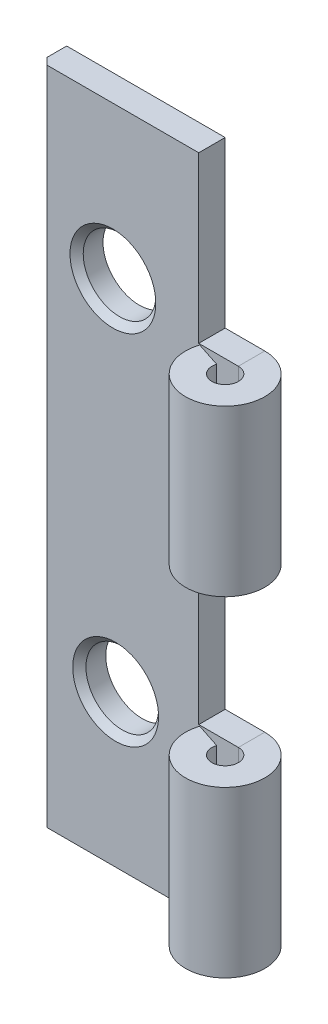
ISO-10303-21;
HEADER;
FILE_DESCRIPTION(('STEP AP214'),'2;1');
FILE_NAME('part.step','',(''),(''),'','','');
FILE_SCHEMA(('AUTOMOTIVE_DESIGN { 1 0 10303 214 1 1 1 1 }'));
ENDSEC;
DATA;
#1=APPLICATION_CONTEXT('core data for automotive mechanical design processes');
#2=APPLICATION_PROTOCOL_DEFINITION('international standard','automotive_design',2000,#1);
#3=PRODUCT_CONTEXT('',#1,'mechanical');
#4=PRODUCT('Part','Part','',(#3));
#5=PRODUCT_RELATED_PRODUCT_CATEGORY('part','',(#4));
#6=PRODUCT_DEFINITION_FORMATION('','',#4);
#7=PRODUCT_DEFINITION_CONTEXT('part definition',#1,'design');
#8=PRODUCT_DEFINITION('design','',#6,#7);
#9=PRODUCT_DEFINITION_SHAPE('','',#8);
#10=(LENGTH_UNIT() NAMED_UNIT(*) SI_UNIT(.MILLI.,.METRE.));
#11=(NAMED_UNIT(*) PLANE_ANGLE_UNIT() SI_UNIT($,.RADIAN.));
#12=(NAMED_UNIT(*) SI_UNIT($,.STERADIAN.) SOLID_ANGLE_UNIT());
#13=UNCERTAINTY_MEASURE_WITH_UNIT(LENGTH_MEASURE(1.E-05),#10,'distance_accuracy_value','');
#14=(GEOMETRIC_REPRESENTATION_CONTEXT(3) GLOBAL_UNCERTAINTY_ASSIGNED_CONTEXT((#13)) GLOBAL_UNIT_ASSIGNED_CONTEXT((#10,
#11,#12)) REPRESENTATION_CONTEXT('',''));
#15=CARTESIAN_POINT('',(0.,0.,0.));
#16=DIRECTION('',(0.,0.,1.));
#17=DIRECTION('',(1.,0.,0.));
#18=AXIS2_PLACEMENT_3D('',#15,#16,#17);
#19=CARTESIAN_POINT('',(0.,0.,0.));
#20=DIRECTION('',(0.,0.,-1.));
#21=DIRECTION('',(-1.,0.,0.));
#22=AXIS2_PLACEMENT_3D('',#19,#20,#21);
#23=PLANE('',#22);
#24=CARTESIAN_POINT('',(1.342615779689,-13.5,0.));
#25=DIRECTION('',(0.,0.,-1.));
#26=DIRECTION('',(-1.,0.,0.));
#27=AXIS2_PLACEMENT_3D('',#24,#25,#26);
#28=CIRCLE('',#27,3.25);
#29=CARTESIAN_POINT('',(-1.907384220311,-13.5,0.));
#30=VERTEX_POINT('',#29);
#31=EDGE_CURVE('E181',#30,#30,#28,.T.);
#32=ORIENTED_EDGE('',*,*,#31,.T.);
#33=EDGE_LOOP('',(#32));
#34=FACE_BOUND('',#33,.T.);
#35=CARTESIAN_POINT('',(1.13428782480229,13.5,0.));
#36=DIRECTION('',(0.,0.,-1.));
#37=DIRECTION('',(-1.,0.,0.));
#38=AXIS2_PLACEMENT_3D('',#35,#36,#37);
#39=CIRCLE('',#38,3.25);
#40=CARTESIAN_POINT('',(-2.11571217519771,13.5,0.));
#41=VERTEX_POINT('',#40);
#42=EDGE_CURVE('E178',#41,#41,#39,.T.);
#43=ORIENTED_EDGE('',*,*,#42,.T.);
#44=EDGE_LOOP('',(#43));
#45=FACE_BOUND('',#44,.T.);
#46=DIRECTION('',(-1.,0.,0.));
#47=VECTOR('',#46,1.);
#48=CARTESIAN_POINT('',(-4.36571217519771,25.,0.));
#49=LINE('',#48,#47);
#50=CARTESIAN_POINT('',(7.63428782480229,25.,0.));
#51=VERTEX_POINT('',#50);
#52=CARTESIAN_POINT('',(-3.86571217519771,25.,0.));
#53=VERTEX_POINT('',#52);
#54=EDGE_CURVE('E141',#51,#53,#49,.T.);
#55=ORIENTED_EDGE('',*,*,#54,.T.);
#56=DIRECTION('',(0.,-1.,0.));
#57=VECTOR('',#56,1.);
#58=CARTESIAN_POINT('',(-3.86571217519771,-25.,0.));
#59=LINE('',#58,#57);
#60=CARTESIAN_POINT('',(-3.86571217519771,-25.,0.));
#61=VERTEX_POINT('',#60);
#62=EDGE_CURVE('E175',#53,#61,#59,.T.);
#63=ORIENTED_EDGE('',*,*,#62,.T.);
#64=DIRECTION('',(1.,0.,0.));
#65=VECTOR('',#64,1.);
#66=CARTESIAN_POINT('',(-4.36571217519771,-25.,0.));
#67=LINE('',#66,#65);
#68=CARTESIAN_POINT('',(10.6342878248023,-25.,0.));
#69=VERTEX_POINT('',#68);
#70=EDGE_CURVE('E153',#61,#69,#67,.T.);
#71=ORIENTED_EDGE('',*,*,#70,.T.);
#72=DIRECTION('',(0.,1.,0.));
#73=VECTOR('',#72,1.);
#74=CARTESIAN_POINT('',(10.6342878248023,-25.,0.));
#75=LINE('',#74,#73);
#76=CARTESIAN_POINT('',(10.6342878248023,-12.5,0.));
#77=VERTEX_POINT('',#76);
#78=EDGE_CURVE('E160',#69,#77,#75,.T.);
#79=ORIENTED_EDGE('',*,*,#78,.T.);
#80=DIRECTION('',(1.,0.,0.));
#81=VECTOR('',#80,1.);
#82=CARTESIAN_POINT('',(10.6342878248023,-12.5,0.));
#83=LINE('',#82,#81);
#84=CARTESIAN_POINT('',(7.63428782480229,-12.5,0.));
#85=VERTEX_POINT('',#84);
#86=EDGE_CURVE('E262',#85,#77,#83,.T.);
#87=ORIENTED_EDGE('',*,*,#86,.F.);
#88=DIRECTION('',(0.,-1.,0.));
#89=VECTOR('',#88,1.);
#90=CARTESIAN_POINT('',(7.63428782480229,0.,0.));
#91=LINE('',#90,#89);
#92=CARTESIAN_POINT('',(7.63428782480229,0.,0.));
#93=VERTEX_POINT('',#92);
#94=EDGE_CURVE('E247',#93,#85,#91,.T.);
#95=ORIENTED_EDGE('',*,*,#94,.F.);
#96=DIRECTION('',(-1.,0.,0.));
#97=VECTOR('',#96,1.);
#98=CARTESIAN_POINT('',(10.6342878248023,0.,0.));
#99=LINE('',#98,#97);
#100=CARTESIAN_POINT('',(10.6342878248023,0.,0.));
#101=VERTEX_POINT('',#100);
#102=EDGE_CURVE('E244',#101,#93,#99,.T.);
#103=ORIENTED_EDGE('',*,*,#102,.F.);
#104=DIRECTION('',(0.,1.,0.));
#105=VECTOR('',#104,1.);
#106=CARTESIAN_POINT('',(10.6342878248023,12.5,0.));
#107=LINE('',#106,#105);
#108=CARTESIAN_POINT('',(10.6342878248023,12.5,0.));
#109=VERTEX_POINT('',#108);
#110=EDGE_CURVE('E314',#109,#101,#107,.F.);
#111=ORIENTED_EDGE('',*,*,#110,.F.);
#112=DIRECTION('',(1.,0.,0.));
#113=VECTOR('',#112,1.);
#114=CARTESIAN_POINT('',(10.6342878248023,12.5,0.));
#115=LINE('',#114,#113);
#116=CARTESIAN_POINT('',(7.63428782480229,12.5,0.));
#117=VERTEX_POINT('',#116);
#118=EDGE_CURVE('E134',#117,#109,#115,.T.);
#119=ORIENTED_EDGE('',*,*,#118,.F.);
#120=DIRECTION('',(0.,-1.,0.));
#121=VECTOR('',#120,1.);
#122=CARTESIAN_POINT('',(7.63428782480229,25.,0.));
#123=LINE('',#122,#121);
#124=EDGE_CURVE('E252',#51,#117,#123,.T.);
#125=ORIENTED_EDGE('',*,*,#124,.F.);
#126=EDGE_LOOP('',(#55,#63,#71,#79,#87,#95,#103,#111,#119,#125));
#127=FACE_BOUND('',#126,.T.);
#128=ADVANCED_FACE('F17',(#34,#45,#127),#23,.F.);
#129=CARTESIAN_POINT('',(-4.36571217519771,-25.,-2.));
#130=DIRECTION('',(0.,-1.,0.));
#131=DIRECTION('',(0.,0.,-1.));
#132=AXIS2_PLACEMENT_3D('',#129,#130,#131);
#133=PLANE('',#132);
#134=ORIENTED_EDGE('',*,*,#70,.F.);
#135=DIRECTION('',(-0.707106781186548,0.,-0.707106781186548));
#136=VECTOR('',#135,1.);
#137=CARTESIAN_POINT('',(-5.11571217519771,-25.,-1.25));
#138=LINE('',#137,#136);
#139=CARTESIAN_POINT('',(-4.36571217519771,-25.,-0.5));
#140=VERTEX_POINT('',#139);
#141=EDGE_CURVE('E39',#61,#140,#138,.T.);
#142=ORIENTED_EDGE('',*,*,#141,.T.);
#143=DIRECTION('',(0.,0.,1.));
#144=VECTOR('',#143,1.);
#145=CARTESIAN_POINT('',(-4.36571217519771,-25.,-2.));
#146=LINE('',#145,#144);
#147=CARTESIAN_POINT('',(-4.36571217519771,-25.,-2.));
#148=VERTEX_POINT('',#147);
#149=EDGE_CURVE('E170',#148,#140,#146,.T.);
#150=ORIENTED_EDGE('',*,*,#149,.F.);
#151=DIRECTION('',(1.,0.,0.));
#152=VECTOR('',#151,1.);
#153=CARTESIAN_POINT('',(-4.36571217519771,-25.,-2.));
#154=LINE('',#153,#152);
#155=CARTESIAN_POINT('',(10.6342878248023,-25.,-2.));
#156=VERTEX_POINT('',#155);
#157=EDGE_CURVE('E150',#148,#156,#154,.T.);
#158=ORIENTED_EDGE('',*,*,#157,.T.);
#159=DIRECTION('',(0.,0.,1.));
#160=VECTOR('',#159,1.);
#161=CARTESIAN_POINT('',(10.6342878248023,-25.,-2.));
#162=LINE('',#161,#160);
#163=EDGE_CURVE('E166',#156,#69,#162,.T.);
#164=ORIENTED_EDGE('',*,*,#163,.T.);
#165=EDGE_LOOP('',(#134,#142,#150,#158,#164));
#166=FACE_BOUND('',#165,.T.);
#167=ADVANCED_FACE('F207',(#166),#133,.T.);
#168=CARTESIAN_POINT('',(-4.36571217519771,-25.,-2.));
#169=DIRECTION('',(-1.,0.,0.));
#170=DIRECTION('',(0.,0.,1.));
#171=AXIS2_PLACEMENT_3D('',#168,#169,#170);
#172=PLANE('',#171);
#173=ORIENTED_EDGE('',*,*,#149,.T.);
#174=DIRECTION('',(0.,1.,0.));
#175=VECTOR('',#174,1.);
#176=CARTESIAN_POINT('',(-4.36571217519771,25.,-0.5));
#177=LINE('',#176,#175);
#178=CARTESIAN_POINT('',(-4.36571217519771,25.,-0.5));
#179=VERTEX_POINT('',#178);
#180=EDGE_CURVE('E25',#140,#179,#177,.T.);
#181=ORIENTED_EDGE('',*,*,#180,.T.);
#182=DIRECTION('',(0.,0.,1.));
#183=VECTOR('',#182,1.);
#184=CARTESIAN_POINT('',(-4.36571217519771,25.,-2.));
#185=LINE('',#184,#183);
#186=CARTESIAN_POINT('',(-4.36571217519771,25.,-2.));
#187=VERTEX_POINT('',#186);
#188=EDGE_CURVE('E159',#187,#179,#185,.T.);
#189=ORIENTED_EDGE('',*,*,#188,.F.);
#190=DIRECTION('',(0.,-1.,0.));
#191=VECTOR('',#190,1.);
#192=CARTESIAN_POINT('',(-4.36571217519771,-25.,-2.));
#193=LINE('',#192,#191);
#194=EDGE_CURVE('E147',#187,#148,#193,.T.);
#195=ORIENTED_EDGE('',*,*,#194,.T.);
#196=EDGE_LOOP('',(#173,#181,#189,#195));
#197=FACE_BOUND('',#196,.T.);
#198=ADVANCED_FACE('F214',(#197),#172,.T.);
#199=CARTESIAN_POINT('',(-4.36571217519771,25.,-2.));
#200=DIRECTION('',(0.,1.,0.));
#201=DIRECTION('',(0.,0.,1.));
#202=AXIS2_PLACEMENT_3D('',#199,#200,#201);
#203=PLANE('',#202);
#204=ORIENTED_EDGE('',*,*,#188,.T.);
#205=DIRECTION('',(0.707106781186548,0.,0.707106781186548));
#206=VECTOR('',#205,1.);
#207=CARTESIAN_POINT('',(-5.11571217519771,25.,-1.25));
#208=LINE('',#207,#206);
#209=EDGE_CURVE('E11',#179,#53,#208,.T.);
#210=ORIENTED_EDGE('',*,*,#209,.T.);
#211=ORIENTED_EDGE('',*,*,#54,.F.);
#212=DIRECTION('',(0.,0.,1.));
#213=VECTOR('',#212,1.);
#214=CARTESIAN_POINT('',(7.63428782480229,25.,-2.));
#215=LINE('',#214,#213);
#216=CARTESIAN_POINT('',(7.63428782480229,25.,-2.));
#217=VERTEX_POINT('',#216);
#218=EDGE_CURVE('E126',#217,#51,#215,.T.);
#219=ORIENTED_EDGE('',*,*,#218,.F.);
#220=DIRECTION('',(-1.,0.,0.));
#221=VECTOR('',#220,1.);
#222=CARTESIAN_POINT('',(-4.36571217519771,25.,-2.));
#223=LINE('',#222,#221);
#224=EDGE_CURVE('E139',#217,#187,#223,.T.);
#225=ORIENTED_EDGE('',*,*,#224,.T.);
#226=EDGE_LOOP('',(#204,#210,#211,#219,#225));
#227=FACE_BOUND('',#226,.T.);
#228=ADVANCED_FACE('F138',(#227),#203,.T.);
#229=CARTESIAN_POINT('',(0.,0.,-2.));
#230=DIRECTION('',(0.,0.,-1.));
#231=DIRECTION('',(-1.,0.,0.));
#232=AXIS2_PLACEMENT_3D('',#229,#230,#231);
#233=PLANE('',#232);
#234=CARTESIAN_POINT('',(1.13428782480229,13.5,-2.));
#235=DIRECTION('',(0.,0.,-1.));
#236=DIRECTION('',(-1.,0.,0.));
#237=AXIS2_PLACEMENT_3D('',#234,#235,#236);
#238=CIRCLE('',#237,2.75);
#239=CARTESIAN_POINT('',(-1.61571217519771,13.5,-2.));
#240=VERTEX_POINT('',#239);
#241=EDGE_CURVE('E239',#240,#240,#238,.T.);
#242=ORIENTED_EDGE('',*,*,#241,.F.);
#243=EDGE_LOOP('',(#242));
#244=FACE_BOUND('',#243,.T.);
#245=CARTESIAN_POINT('',(1.342615779689,-13.5,-2.));
#246=DIRECTION('',(0.,0.,-1.));
#247=DIRECTION('',(-1.,0.,0.));
#248=AXIS2_PLACEMENT_3D('',#245,#246,#247);
#249=CIRCLE('',#248,2.75);
#250=CARTESIAN_POINT('',(-1.407384220311,-13.5,-2.));
#251=VERTEX_POINT('',#250);
#252=EDGE_CURVE('E242',#251,#251,#249,.T.);
#253=ORIENTED_EDGE('',*,*,#252,.F.);
#254=EDGE_LOOP('',(#253));
#255=FACE_BOUND('',#254,.T.);
#256=DIRECTION('',(1.,0.,0.));
#257=VECTOR('',#256,1.);
#258=CARTESIAN_POINT('',(10.6342878248023,12.5,-2.));
#259=LINE('',#258,#257);
#260=CARTESIAN_POINT('',(7.63428782480229,12.5,-2.));
#261=VERTEX_POINT('',#260);
#262=CARTESIAN_POINT('',(10.6342878248023,12.5,-2.));
#263=VERTEX_POINT('',#262);
#264=EDGE_CURVE('E133',#261,#263,#259,.T.);
#265=ORIENTED_EDGE('',*,*,#264,.T.);
#266=DIRECTION('',(0.,1.,0.));
#267=VECTOR('',#266,1.);
#268=CARTESIAN_POINT('',(10.6342878248023,12.5,-2.));
#269=LINE('',#268,#267);
#270=CARTESIAN_POINT('',(10.6342878248023,0.,-2.));
#271=VERTEX_POINT('',#270);
#272=EDGE_CURVE('E298',#263,#271,#269,.F.);
#273=ORIENTED_EDGE('',*,*,#272,.T.);
#274=DIRECTION('',(-1.,0.,0.));
#275=VECTOR('',#274,1.);
#276=CARTESIAN_POINT('',(10.6342878248023,0.,-2.));
#277=LINE('',#276,#275);
#278=CARTESIAN_POINT('',(7.63428782480229,0.,-2.));
#279=VERTEX_POINT('',#278);
#280=EDGE_CURVE('E258',#271,#279,#277,.T.);
#281=ORIENTED_EDGE('',*,*,#280,.T.);
#282=DIRECTION('',(0.,-1.,0.));
#283=VECTOR('',#282,1.);
#284=CARTESIAN_POINT('',(7.63428782480229,0.,-2.));
#285=LINE('',#284,#283);
#286=CARTESIAN_POINT('',(7.63428782480229,-12.5,-2.));
#287=VERTEX_POINT('',#286);
#288=EDGE_CURVE('E261',#279,#287,#285,.T.);
#289=ORIENTED_EDGE('',*,*,#288,.T.);
#290=DIRECTION('',(1.,0.,0.));
#291=VECTOR('',#290,1.);
#292=CARTESIAN_POINT('',(10.6342878248023,-12.5,-2.));
#293=LINE('',#292,#291);
#294=CARTESIAN_POINT('',(10.6342878248023,-12.5,-2.));
#295=VERTEX_POINT('',#294);
#296=EDGE_CURVE('E265',#287,#295,#293,.T.);
#297=ORIENTED_EDGE('',*,*,#296,.T.);
#298=DIRECTION('',(0.,1.,0.));
#299=VECTOR('',#298,1.);
#300=CARTESIAN_POINT('',(10.6342878248023,-25.,-2.));
#301=LINE('',#300,#299);
#302=EDGE_CURVE('E148',#156,#295,#301,.T.);
#303=ORIENTED_EDGE('',*,*,#302,.F.);
#304=ORIENTED_EDGE('',*,*,#157,.F.);
#305=ORIENTED_EDGE('',*,*,#194,.F.);
#306=ORIENTED_EDGE('',*,*,#224,.F.);
#307=DIRECTION('',(0.,-1.,0.));
#308=VECTOR('',#307,1.);
#309=CARTESIAN_POINT('',(7.63428782480229,25.,-2.));
#310=LINE('',#309,#308);
#311=EDGE_CURVE('E122',#217,#261,#310,.T.);
#312=ORIENTED_EDGE('',*,*,#311,.T.);
#313=EDGE_LOOP('',(#265,#273,#281,#289,#297,#303,#304,#305,#306,#312));
#314=FACE_BOUND('',#313,.T.);
#315=ADVANCED_FACE('F144',(#244,#255,#314),#233,.T.);
#316=CARTESIAN_POINT('',(9.68323130850714,6.25,0.690983005625043));
#317=DIRECTION('',(-0.309016994374957,0.,0.95105651629515));
#318=DIRECTION('',(0.,1.,0.));
#319=AXIS2_PLACEMENT_3D('',#316,#317,#318);
#320=PLANE('',#319);
#321=DIRECTION('',(-0.95105651629515,0.,-0.309016994374957));
#322=VECTOR('',#321,1.);
#323=CARTESIAN_POINT('',(9.68323130850714,12.5,0.690983005625043));
#324=LINE('',#323,#322);
#325=CARTESIAN_POINT('',(9.68323130850714,12.5,0.690983005625043));
#326=VERTEX_POINT('',#325);
#327=CARTESIAN_POINT('',(7.78111827591684,12.5,0.0729490168751275));
#328=VERTEX_POINT('',#327);
#329=EDGE_CURVE('E163',#326,#328,#324,.T.);
#330=ORIENTED_EDGE('',*,*,#329,.F.);
#331=DIRECTION('',(0.,1.,0.));
#332=VECTOR('',#331,1.);
#333=CARTESIAN_POINT('',(9.68323130850714,12.5,0.690983005625043));
#334=LINE('',#333,#332);
#335=CARTESIAN_POINT('',(9.68323130850714,0.,0.690983005625043));
#336=VERTEX_POINT('',#335);
#337=EDGE_CURVE('E296',#336,#326,#334,.T.);
#338=ORIENTED_EDGE('',*,*,#337,.F.);
#339=DIRECTION('',(-0.95105651629515,0.,-0.309016994374957));
#340=VECTOR('',#339,1.);
#341=CARTESIAN_POINT('',(9.68323130850714,0.,0.690983005625043));
#342=LINE('',#341,#340);
#343=CARTESIAN_POINT('',(7.78111827591684,0.,0.0729490168751275));
#344=VERTEX_POINT('',#343);
#345=EDGE_CURVE('E325',#336,#344,#342,.T.);
#346=ORIENTED_EDGE('',*,*,#345,.T.);
#347=DIRECTION('',(0.,1.,0.));
#348=VECTOR('',#347,1.);
#349=CARTESIAN_POINT('',(7.78111827591684,12.5,0.0729490168751275));
#350=LINE('',#349,#348);
#351=EDGE_CURVE('E306',#344,#328,#350,.T.);
#352=ORIENTED_EDGE('',*,*,#351,.T.);
#353=EDGE_LOOP('',(#330,#338,#346,#352));
#354=FACE_BOUND('',#353,.T.);
#355=ADVANCED_FACE('F227',(#354),#320,.F.);
#356=CARTESIAN_POINT('',(10.6342878248023,0.,1.));
#357=DIRECTION('',(0.,-1.,0.));
#358=DIRECTION('',(0.,0.,-1.));
#359=AXIS2_PLACEMENT_3D('',#356,#357,#358);
#360=PLANE('',#359);
#361=ORIENTED_EDGE('',*,*,#345,.F.);
#362=CARTESIAN_POINT('',(10.6342878248023,0.,1.));
#363=DIRECTION('',(0.,1.,0.));
#364=DIRECTION('',(0.,0.,1.));
#365=AXIS2_PLACEMENT_3D('',#362,#363,#364);
#366=CIRCLE('',#365,1.);
#367=EDGE_CURVE('E309',#101,#336,#366,.F.);
#368=ORIENTED_EDGE('',*,*,#367,.F.);
#369=DIRECTION('',(0.,0.,-1.));
#370=VECTOR('',#369,1.);
#371=CARTESIAN_POINT('',(10.6342878248023,0.,0.));
#372=LINE('',#371,#370);
#373=EDGE_CURVE('E322',#101,#271,#372,.T.);
#374=ORIENTED_EDGE('',*,*,#373,.T.);
#375=CARTESIAN_POINT('',(10.6342878248023,0.,1.));
#376=DIRECTION('',(0.,1.,0.));
#377=DIRECTION('',(0.,0.,1.));
#378=AXIS2_PLACEMENT_3D('',#375,#376,#377);
#379=CIRCLE('',#378,3.);
#380=EDGE_CURVE('E301',#271,#344,#379,.F.);
#381=ORIENTED_EDGE('',*,*,#380,.T.);
#382=EDGE_LOOP('',(#361,#368,#374,#381));
#383=FACE_BOUND('',#382,.T.);
#384=ADVANCED_FACE('F233',(#383),#360,.T.);
#385=CARTESIAN_POINT('',(10.6342878248023,12.5,1.));
#386=DIRECTION('',(0.,-1.,0.));
#387=DIRECTION('',(0.,0.,-1.));
#388=AXIS2_PLACEMENT_3D('',#385,#386,#387);
#389=PLANE('',#388);
#390=CARTESIAN_POINT('',(10.6342878248023,12.5,1.));
#391=DIRECTION('',(0.,1.,0.));
#392=DIRECTION('',(0.,0.,1.));
#393=AXIS2_PLACEMENT_3D('',#390,#391,#392);
#394=CIRCLE('',#393,1.);
#395=EDGE_CURVE('E317',#326,#109,#394,.T.);
#396=ORIENTED_EDGE('',*,*,#395,.F.);
#397=ORIENTED_EDGE('',*,*,#329,.T.);
#398=CARTESIAN_POINT('',(10.6342878248023,12.5,1.));
#399=DIRECTION('',(0.,1.,0.));
#400=DIRECTION('',(0.,0.,1.));
#401=AXIS2_PLACEMENT_3D('',#398,#399,#400);
#402=CIRCLE('',#401,3.);
#403=EDGE_CURVE('E302',#328,#263,#402,.T.);
#404=ORIENTED_EDGE('',*,*,#403,.T.);
#405=DIRECTION('',(0.,0.,-1.));
#406=VECTOR('',#405,1.);
#407=CARTESIAN_POINT('',(10.6342878248023,12.5,0.));
#408=LINE('',#407,#406);
#409=EDGE_CURVE('E305',#109,#263,#408,.T.);
#410=ORIENTED_EDGE('',*,*,#409,.F.);
#411=EDGE_LOOP('',(#396,#397,#404,#410));
#412=FACE_BOUND('',#411,.T.);
#413=ADVANCED_FACE('F335',(#412),#389,.F.);
#414=CARTESIAN_POINT('',(10.6342878248023,12.5,1.));
#415=DIRECTION('',(0.,1.,0.));
#416=DIRECTION('',(-0.95105651629515,0.,-0.309016994374957));
#417=AXIS2_PLACEMENT_3D('',#414,#415,#416);
#418=CYLINDRICAL_SURFACE('',#417,3.);
#419=ORIENTED_EDGE('',*,*,#272,.F.);
#420=ORIENTED_EDGE('',*,*,#403,.F.);
#421=ORIENTED_EDGE('',*,*,#351,.F.);
#422=ORIENTED_EDGE('',*,*,#380,.F.);
#423=EDGE_LOOP('',(#419,#420,#421,#422));
#424=FACE_BOUND('',#423,.T.);
#425=ADVANCED_FACE('F339',(#424),#418,.T.);
#426=CARTESIAN_POINT('',(10.6342878248023,12.5,1.));
#427=DIRECTION('',(0.,1.,0.));
#428=DIRECTION('',(-0.95105651629515,0.,-0.309016994374957));
#429=AXIS2_PLACEMENT_3D('',#426,#427,#428);
#430=CYLINDRICAL_SURFACE('',#429,1.);
#431=ORIENTED_EDGE('',*,*,#110,.T.);
#432=ORIENTED_EDGE('',*,*,#367,.T.);
#433=ORIENTED_EDGE('',*,*,#337,.T.);
#434=ORIENTED_EDGE('',*,*,#395,.T.);
#435=EDGE_LOOP('',(#431,#432,#433,#434));
#436=FACE_BOUND('',#435,.T.);
#437=ADVANCED_FACE('F351',(#436),#430,.F.);
#438=CARTESIAN_POINT('',(9.68323130850714,-18.75,0.690983005625041));
#439=DIRECTION('',(-0.309016994374958,0.,0.95105651629515));
#440=DIRECTION('',(0.,1.,0.));
#441=AXIS2_PLACEMENT_3D('',#438,#439,#440);
#442=PLANE('',#441);
#443=DIRECTION('',(-0.95105651629515,0.,-0.309016994374958));
#444=VECTOR('',#443,1.);
#445=CARTESIAN_POINT('',(9.68323130850714,-12.5,0.690983005625041));
#446=LINE('',#445,#444);
#447=CARTESIAN_POINT('',(9.68323130850714,-12.5,0.690983005625041));
#448=VERTEX_POINT('',#447);
#449=CARTESIAN_POINT('',(7.78111827591684,-12.5,0.0729490168751239));
#450=VERTEX_POINT('',#449);
#451=EDGE_CURVE('E294',#448,#450,#446,.T.);
#452=ORIENTED_EDGE('',*,*,#451,.F.);
#453=DIRECTION('',(0.,1.,0.));
#454=VECTOR('',#453,1.);
#455=CARTESIAN_POINT('',(9.68323130850714,-12.5,0.690983005625041));
#456=LINE('',#455,#454);
#457=CARTESIAN_POINT('',(9.68323130850714,-25.,0.690983005625041));
#458=VERTEX_POINT('',#457);
#459=EDGE_CURVE('E256',#458,#448,#456,.T.);
#460=ORIENTED_EDGE('',*,*,#459,.F.);
#461=DIRECTION('',(-0.95105651629515,0.,-0.309016994374958));
#462=VECTOR('',#461,1.);
#463=CARTESIAN_POINT('',(9.68323130850714,-25.,0.690983005625041));
#464=LINE('',#463,#462);
#465=CARTESIAN_POINT('',(7.78111827591684,-25.,0.0729490168751239));
#466=VERTEX_POINT('',#465);
#467=EDGE_CURVE('E292',#458,#466,#464,.T.);
#468=ORIENTED_EDGE('',*,*,#467,.T.);
#469=DIRECTION('',(0.,1.,0.));
#470=VECTOR('',#469,1.);
#471=CARTESIAN_POINT('',(7.78111827591684,-12.5,0.0729490168751239));
#472=LINE('',#471,#470);
#473=EDGE_CURVE('E279',#466,#450,#472,.T.);
#474=ORIENTED_EDGE('',*,*,#473,.T.);
#475=EDGE_LOOP('',(#452,#460,#468,#474));
#476=FACE_BOUND('',#475,.T.);
#477=ADVANCED_FACE('F353',(#476),#442,.F.);
#478=CARTESIAN_POINT('',(10.6342878248023,-25.,1.));
#479=DIRECTION('',(0.,-1.,0.));
#480=DIRECTION('',(0.,0.,-1.));
#481=AXIS2_PLACEMENT_3D('',#478,#479,#480);
#482=PLANE('',#481);
#483=ORIENTED_EDGE('',*,*,#467,.F.);
#484=CARTESIAN_POINT('',(10.6342878248023,-25.,1.));
#485=DIRECTION('',(0.,1.,0.));
#486=DIRECTION('',(0.,0.,1.));
#487=AXIS2_PLACEMENT_3D('',#484,#485,#486);
#488=CIRCLE('',#487,1.);
#489=EDGE_CURVE('E282',#69,#458,#488,.F.);
#490=ORIENTED_EDGE('',*,*,#489,.F.);
#491=ORIENTED_EDGE('',*,*,#163,.F.);
#492=CARTESIAN_POINT('',(10.6342878248023,-25.,1.));
#493=DIRECTION('',(0.,1.,0.));
#494=DIRECTION('',(0.,0.,1.));
#495=AXIS2_PLACEMENT_3D('',#492,#493,#494);
#496=CIRCLE('',#495,3.);
#497=EDGE_CURVE('E274',#156,#466,#496,.F.);
#498=ORIENTED_EDGE('',*,*,#497,.T.);
#499=EDGE_LOOP('',(#483,#490,#491,#498));
#500=FACE_BOUND('',#499,.T.);
#501=ADVANCED_FACE('F360',(#500),#482,.T.);
#502=CARTESIAN_POINT('',(10.6342878248023,-12.5,1.));
#503=DIRECTION('',(0.,-1.,0.));
#504=DIRECTION('',(0.,0.,-1.));
#505=AXIS2_PLACEMENT_3D('',#502,#503,#504);
#506=PLANE('',#505);
#507=CARTESIAN_POINT('',(10.6342878248023,-12.5,1.));
#508=DIRECTION('',(0.,1.,0.));
#509=DIRECTION('',(0.,0.,1.));
#510=AXIS2_PLACEMENT_3D('',#507,#508,#509);
#511=CIRCLE('',#510,1.);
#512=EDGE_CURVE('E287',#448,#77,#511,.T.);
#513=ORIENTED_EDGE('',*,*,#512,.F.);
#514=ORIENTED_EDGE('',*,*,#451,.T.);
#515=CARTESIAN_POINT('',(10.6342878248023,-12.5,1.));
#516=DIRECTION('',(0.,1.,0.));
#517=DIRECTION('',(0.,0.,1.));
#518=AXIS2_PLACEMENT_3D('',#515,#516,#517);
#519=CIRCLE('',#518,3.);
#520=EDGE_CURVE('E278',#450,#295,#519,.T.);
#521=ORIENTED_EDGE('',*,*,#520,.T.);
#522=DIRECTION('',(0.,0.,-1.));
#523=VECTOR('',#522,1.);
#524=CARTESIAN_POINT('',(10.6342878248023,-12.5,0.));
#525=LINE('',#524,#523);
#526=EDGE_CURVE('E277',#77,#295,#525,.T.);
#527=ORIENTED_EDGE('',*,*,#526,.F.);
#528=EDGE_LOOP('',(#513,#514,#521,#527));
#529=FACE_BOUND('',#528,.T.);
#530=ADVANCED_FACE('F504',(#529),#506,.F.);
#531=CARTESIAN_POINT('',(10.6342878248023,-12.5,1.));
#532=DIRECTION('',(0.,1.,0.));
#533=DIRECTION('',(-0.95105651629515,0.,-0.309016994374958));
#534=AXIS2_PLACEMENT_3D('',#531,#532,#533);
#535=CYLINDRICAL_SURFACE('',#534,3.);
#536=ORIENTED_EDGE('',*,*,#302,.T.);
#537=ORIENTED_EDGE('',*,*,#520,.F.);
#538=ORIENTED_EDGE('',*,*,#473,.F.);
#539=ORIENTED_EDGE('',*,*,#497,.F.);
#540=EDGE_LOOP('',(#536,#537,#538,#539));
#541=FACE_BOUND('',#540,.T.);
#542=ADVANCED_FACE('F495',(#541),#535,.T.);
#543=CARTESIAN_POINT('',(10.6342878248023,-12.5,1.));
#544=DIRECTION('',(0.,1.,0.));
#545=DIRECTION('',(-0.95105651629515,0.,-0.309016994374958));
#546=AXIS2_PLACEMENT_3D('',#543,#544,#545);
#547=CYLINDRICAL_SURFACE('',#546,1.);
#548=ORIENTED_EDGE('',*,*,#78,.F.);
#549=ORIENTED_EDGE('',*,*,#489,.T.);
#550=ORIENTED_EDGE('',*,*,#459,.T.);
#551=ORIENTED_EDGE('',*,*,#512,.T.);
#552=EDGE_LOOP('',(#548,#549,#550,#551));
#553=FACE_BOUND('',#552,.T.);
#554=ADVANCED_FACE('F486',(#553),#547,.F.);
#555=CARTESIAN_POINT('',(10.6342878248023,-12.5,-2.));
#556=DIRECTION('',(0.,-1.,0.));
#557=DIRECTION('',(1.,0.,0.));
#558=AXIS2_PLACEMENT_3D('',#555,#556,#557);
#559=PLANE('',#558);
#560=ORIENTED_EDGE('',*,*,#86,.T.);
#561=ORIENTED_EDGE('',*,*,#526,.T.);
#562=ORIENTED_EDGE('',*,*,#296,.F.);
#563=DIRECTION('',(0.,0.,1.));
#564=VECTOR('',#563,1.);
#565=CARTESIAN_POINT('',(7.63428782480229,-12.5,-2.));
#566=LINE('',#565,#564);
#567=EDGE_CURVE('E254',#287,#85,#566,.T.);
#568=ORIENTED_EDGE('',*,*,#567,.T.);
#569=EDGE_LOOP('',(#560,#561,#562,#568));
#570=FACE_BOUND('',#569,.T.);
#571=ADVANCED_FACE('F477',(#570),#559,.F.);
#572=CARTESIAN_POINT('',(7.63428782480229,0.,-2.));
#573=DIRECTION('',(-1.,0.,0.));
#574=DIRECTION('',(0.,-1.,0.));
#575=AXIS2_PLACEMENT_3D('',#572,#573,#574);
#576=PLANE('',#575);
#577=ORIENTED_EDGE('',*,*,#94,.T.);
#578=ORIENTED_EDGE('',*,*,#567,.F.);
#579=ORIENTED_EDGE('',*,*,#288,.F.);
#580=DIRECTION('',(0.,0.,1.));
#581=VECTOR('',#580,1.);
#582=CARTESIAN_POINT('',(7.63428782480229,0.,-2.));
#583=LINE('',#582,#581);
#584=EDGE_CURVE('E267',#279,#93,#583,.T.);
#585=ORIENTED_EDGE('',*,*,#584,.T.);
#586=EDGE_LOOP('',(#577,#578,#579,#585));
#587=FACE_BOUND('',#586,.T.);
#588=ADVANCED_FACE('F469',(#587),#576,.F.);
#589=CARTESIAN_POINT('',(10.6342878248023,0.,-2.));
#590=DIRECTION('',(0.,1.,0.));
#591=DIRECTION('',(-1.,0.,0.));
#592=AXIS2_PLACEMENT_3D('',#589,#590,#591);
#593=PLANE('',#592);
#594=ORIENTED_EDGE('',*,*,#102,.T.);
#595=ORIENTED_EDGE('',*,*,#584,.F.);
#596=ORIENTED_EDGE('',*,*,#280,.F.);
#597=ORIENTED_EDGE('',*,*,#373,.F.);
#598=EDGE_LOOP('',(#594,#595,#596,#597));
#599=FACE_BOUND('',#598,.T.);
#600=ADVANCED_FACE('F345',(#599),#593,.F.);
#601=CARTESIAN_POINT('',(10.6342878248023,12.5,-2.));
#602=DIRECTION('',(0.,-1.,0.));
#603=DIRECTION('',(0.,0.,-1.));
#604=AXIS2_PLACEMENT_3D('',#601,#602,#603);
#605=PLANE('',#604);
#606=ORIENTED_EDGE('',*,*,#118,.T.);
#607=ORIENTED_EDGE('',*,*,#409,.T.);
#608=ORIENTED_EDGE('',*,*,#264,.F.);
#609=DIRECTION('',(0.,0.,1.));
#610=VECTOR('',#609,1.);
#611=CARTESIAN_POINT('',(7.63428782480229,12.5,-2.));
#612=LINE('',#611,#610);
#613=EDGE_CURVE('E128',#261,#117,#612,.T.);
#614=ORIENTED_EDGE('',*,*,#613,.T.);
#615=EDGE_LOOP('',(#606,#607,#608,#614));
#616=FACE_BOUND('',#615,.T.);
#617=ADVANCED_FACE('F329',(#616),#605,.F.);
#618=CARTESIAN_POINT('',(7.63428782480229,25.,-2.));
#619=DIRECTION('',(-1.,0.,0.));
#620=DIRECTION('',(0.,-1.,0.));
#621=AXIS2_PLACEMENT_3D('',#618,#619,#620);
#622=PLANE('',#621);
#623=ORIENTED_EDGE('',*,*,#124,.T.);
#624=ORIENTED_EDGE('',*,*,#613,.F.);
#625=ORIENTED_EDGE('',*,*,#311,.F.);
#626=ORIENTED_EDGE('',*,*,#218,.T.);
#627=EDGE_LOOP('',(#623,#624,#625,#626));
#628=FACE_BOUND('',#627,.T.);
#629=ADVANCED_FACE('F125',(#628),#622,.F.);
#630=CARTESIAN_POINT('',(1.342615779689,-13.5,0.));
#631=DIRECTION('',(0.,0.,1.));
#632=DIRECTION('',(1.,0.,0.));
#633=AXIS2_PLACEMENT_3D('',#630,#631,#632);
#634=CYLINDRICAL_SURFACE('',#633,2.75);
#635=CARTESIAN_POINT('',(1.342615779689,-13.5,-0.499999999999991));
#636=DIRECTION('',(0.,0.,-1.));
#637=DIRECTION('',(-1.,0.,0.));
#638=AXIS2_PLACEMENT_3D('',#635,#636,#637);
#639=CIRCLE('',#638,2.75);
#640=CARTESIAN_POINT('',(-1.407384220311,-13.5,-0.499999999999991));
#641=VERTEX_POINT('',#640);
#642=EDGE_CURVE('E169',#641,#641,#639,.F.);
#643=ORIENTED_EDGE('',*,*,#642,.T.);
#644=EDGE_LOOP('',(#643));
#645=FACE_BOUND('',#644,.T.);
#646=ORIENTED_EDGE('',*,*,#252,.T.);
#647=EDGE_LOOP('',(#646));
#648=FACE_BOUND('',#647,.T.);
#649=ADVANCED_FACE('F440',(#645,#648),#634,.F.);
#650=CARTESIAN_POINT('',(1.13428782480229,13.5,0.));
#651=DIRECTION('',(0.,0.,1.));
#652=DIRECTION('',(1.,0.,0.));
#653=AXIS2_PLACEMENT_3D('',#650,#651,#652);
#654=CYLINDRICAL_SURFACE('',#653,2.75);
#655=CARTESIAN_POINT('',(1.13428782480229,13.5,-0.499999999999991));
#656=DIRECTION('',(0.,0.,-1.));
#657=DIRECTION('',(-1.,0.,0.));
#658=AXIS2_PLACEMENT_3D('',#655,#656,#657);
#659=CIRCLE('',#658,2.75);
#660=CARTESIAN_POINT('',(-1.61571217519771,13.5,-0.499999999999991));
#661=VERTEX_POINT('',#660);
#662=EDGE_CURVE('E184',#661,#661,#659,.F.);
#663=ORIENTED_EDGE('',*,*,#662,.T.);
#664=EDGE_LOOP('',(#663));
#665=FACE_BOUND('',#664,.T.);
#666=ORIENTED_EDGE('',*,*,#241,.T.);
#667=EDGE_LOOP('',(#666));
#668=FACE_BOUND('',#667,.T.);
#669=ADVANCED_FACE('F189',(#665,#668),#654,.F.);
#670=CARTESIAN_POINT('',(1.342615779689,-13.5,-0.499999999999991));
#671=DIRECTION('',(0.,0.,1.));
#672=DIRECTION('',(1.,0.,0.));
#673=AXIS2_PLACEMENT_3D('',#670,#671,#672);
#674=CONICAL_SURFACE('',#673,2.75,0.785398163397446);
#675=ORIENTED_EDGE('',*,*,#31,.F.);
#676=EDGE_LOOP('',(#675));
#677=FACE_BOUND('',#676,.T.);
#678=ORIENTED_EDGE('',*,*,#642,.F.);
#679=EDGE_LOOP('',(#678));
#680=FACE_BOUND('',#679,.T.);
#681=ADVANCED_FACE('F194',(#677,#680),#674,.F.);
#682=CARTESIAN_POINT('',(1.13428782480229,13.5,-0.499999999999991));
#683=DIRECTION('',(0.,0.,1.));
#684=DIRECTION('',(1.,0.,0.));
#685=AXIS2_PLACEMENT_3D('',#682,#683,#684);
#686=CONICAL_SURFACE('',#685,2.75,0.785398163397446);
#687=ORIENTED_EDGE('',*,*,#42,.F.);
#688=EDGE_LOOP('',(#687));
#689=FACE_BOUND('',#688,.T.);
#690=ORIENTED_EDGE('',*,*,#662,.F.);
#691=EDGE_LOOP('',(#690));
#692=FACE_BOUND('',#691,.T.);
#693=ADVANCED_FACE('F192',(#689,#692),#686,.F.);
#694=CARTESIAN_POINT('',(-3.86571217519771,0.,0.));
#695=DIRECTION('',(-0.707106781186548,0.,0.707106781186548));
#696=DIRECTION('',(0.,1.,0.));
#697=AXIS2_PLACEMENT_3D('',#694,#695,#696);
#698=PLANE('',#697);
#699=ORIENTED_EDGE('',*,*,#209,.F.);
#700=ORIENTED_EDGE('',*,*,#180,.F.);
#701=ORIENTED_EDGE('',*,*,#141,.F.);
#702=ORIENTED_EDGE('',*,*,#62,.F.);
#703=EDGE_LOOP('',(#699,#700,#701,#702));
#704=FACE_BOUND('',#703,.T.);
#705=ADVANCED_FACE('F19',(#704),#698,.T.);
#706=CLOSED_SHELL('',(#128,#167,#198,#228,#315,#355,#384,#413,#425,#437,#477,#501,#530,#542,
#554,#571,#588,#600,#617,#629,#649,#669,#681,#693,#705));
#707=MANIFOLD_SOLID_BREP('B1',#706);
#708=ADVANCED_BREP_SHAPE_REPRESENTATION('',(#18,#707),#14);
#709=SHAPE_DEFINITION_REPRESENTATION(#9,#708);
ENDSEC;
END-ISO-10303-21;
